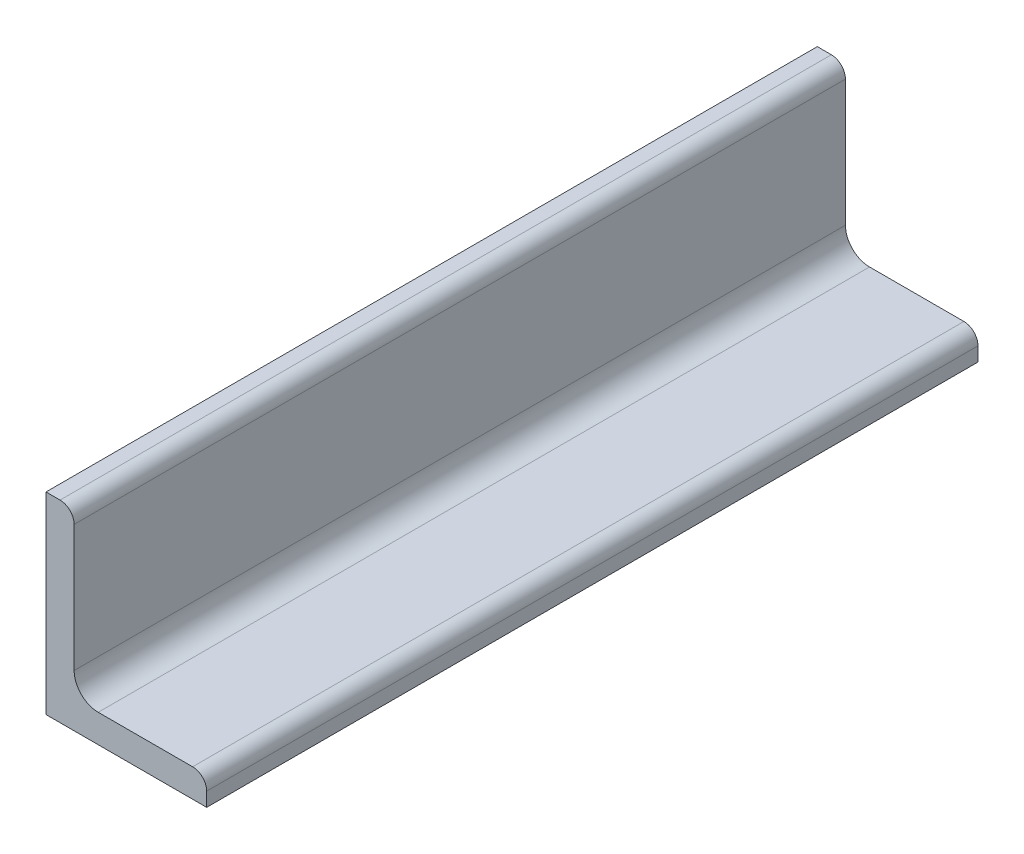
ISO-10303-21;
HEADER;
FILE_DESCRIPTION(('STEP AP214'),'2;1');
FILE_NAME('part.step','',(''),(''),'','','');
FILE_SCHEMA(('AUTOMOTIVE_DESIGN { 1 0 10303 214 1 1 1 1 }'));
ENDSEC;
DATA;
#1=APPLICATION_CONTEXT('core data for automotive mechanical design processes');
#2=APPLICATION_PROTOCOL_DEFINITION('international standard','automotive_design',2000,#1);
#3=PRODUCT_CONTEXT('',#1,'mechanical');
#4=PRODUCT('Part','Part','',(#3));
#5=PRODUCT_RELATED_PRODUCT_CATEGORY('part','',(#4));
#6=PRODUCT_DEFINITION_FORMATION('','',#4);
#7=PRODUCT_DEFINITION_CONTEXT('part definition',#1,'design');
#8=PRODUCT_DEFINITION('design','',#6,#7);
#9=PRODUCT_DEFINITION_SHAPE('','',#8);
#10=(LENGTH_UNIT() NAMED_UNIT(*) SI_UNIT(.MILLI.,.METRE.));
#11=(NAMED_UNIT(*) PLANE_ANGLE_UNIT() SI_UNIT($,.RADIAN.));
#12=(NAMED_UNIT(*) SI_UNIT($,.STERADIAN.) SOLID_ANGLE_UNIT());
#13=UNCERTAINTY_MEASURE_WITH_UNIT(LENGTH_MEASURE(1.E-05),#10,'distance_accuracy_value','');
#14=(GEOMETRIC_REPRESENTATION_CONTEXT(3) GLOBAL_UNCERTAINTY_ASSIGNED_CONTEXT((#13)) GLOBAL_UNIT_ASSIGNED_CONTEXT((#10,
#11,#12)) REPRESENTATION_CONTEXT('',''));
#15=CARTESIAN_POINT('',(0.,0.,0.));
#16=DIRECTION('',(0.,0.,1.));
#17=DIRECTION('',(1.,0.,0.));
#18=AXIS2_PLACEMENT_3D('',#15,#16,#17);
#19=CARTESIAN_POINT('',(0.897927251325018,76.2882459217981,304.8));
#20=DIRECTION('',(1.,0.,0.));
#21=DIRECTION('',(0.,0.,-1.));
#22=AXIS2_PLACEMENT_3D('',#19,#20,#21);
#23=PLANE('',#22);
#24=DIRECTION('',(0.,-1.,0.));
#25=VECTOR('',#24,1.);
#26=CARTESIAN_POINT('',(0.897927251325018,76.2882459217981,0.));
#27=LINE('',#26,#25);
#28=CARTESIAN_POINT('',(0.897927251325018,76.2882459217981,0.));
#29=VERTEX_POINT('',#28);
#30=CARTESIAN_POINT('',(0.897927251325018,0.0882459217980795,0.));
#31=VERTEX_POINT('',#30);
#32=EDGE_CURVE('E135',#29,#31,#27,.T.);
#33=ORIENTED_EDGE('',*,*,#32,.T.);
#34=DIRECTION('',(0.,0.,-1.));
#35=VECTOR('',#34,1.);
#36=CARTESIAN_POINT('',(0.897927251325018,0.0882459217980795,304.8));
#37=LINE('',#36,#35);
#38=CARTESIAN_POINT('',(0.897927251325018,0.0882459217980795,304.8));
#39=VERTEX_POINT('',#38);
#40=EDGE_CURVE('E11',#39,#31,#37,.T.);
#41=ORIENTED_EDGE('',*,*,#40,.F.);
#42=DIRECTION('',(0.,-1.,0.));
#43=VECTOR('',#42,1.);
#44=CARTESIAN_POINT('',(0.897927251325018,76.2882459217981,304.8));
#45=LINE('',#44,#43);
#46=CARTESIAN_POINT('',(0.897927251325018,76.2882459217981,304.8));
#47=VERTEX_POINT('',#46);
#48=EDGE_CURVE('E151',#47,#39,#45,.T.);
#49=ORIENTED_EDGE('',*,*,#48,.F.);
#50=DIRECTION('',(0.,0.,-1.));
#51=VECTOR('',#50,1.);
#52=CARTESIAN_POINT('',(0.897927251325018,76.2882459217981,304.8));
#53=LINE('',#52,#51);
#54=EDGE_CURVE('E131',#47,#29,#53,.T.);
#55=ORIENTED_EDGE('',*,*,#54,.T.);
#56=EDGE_LOOP('',(#33,#41,#49,#55));
#57=FACE_BOUND('',#56,.T.);
#58=ADVANCED_FACE('F33',(#57),#23,.F.);
#59=CARTESIAN_POINT('',(0.897927251325018,0.0882459217980795,304.8));
#60=DIRECTION('',(0.,1.,0.));
#61=DIRECTION('',(0.,0.,1.));
#62=AXIS2_PLACEMENT_3D('',#59,#60,#61);
#63=PLANE('',#62);
#64=DIRECTION('',(1.,0.,0.));
#65=VECTOR('',#64,1.);
#66=CARTESIAN_POINT('',(0.897927251325018,0.0882459217980795,0.));
#67=LINE('',#66,#65);
#68=CARTESIAN_POINT('',(64.397927251325,0.0882459217980795,0.));
#69=VERTEX_POINT('',#68);
#70=EDGE_CURVE('E138',#31,#69,#67,.T.);
#71=ORIENTED_EDGE('',*,*,#70,.T.);
#72=DIRECTION('',(0.,0.,-1.));
#73=VECTOR('',#72,1.);
#74=CARTESIAN_POINT('',(64.397927251325,0.0882459217980795,304.8));
#75=LINE('',#74,#73);
#76=CARTESIAN_POINT('',(64.397927251325,0.0882459217980795,304.8));
#77=VERTEX_POINT('',#76);
#78=EDGE_CURVE('E41',#77,#69,#75,.T.);
#79=ORIENTED_EDGE('',*,*,#78,.F.);
#80=DIRECTION('',(1.,0.,0.));
#81=VECTOR('',#80,1.);
#82=CARTESIAN_POINT('',(0.897927251325018,0.0882459217980795,304.8));
#83=LINE('',#82,#81);
#84=EDGE_CURVE('E95',#39,#77,#83,.T.);
#85=ORIENTED_EDGE('',*,*,#84,.F.);
#86=ORIENTED_EDGE('',*,*,#40,.T.);
#87=EDGE_LOOP('',(#71,#79,#85,#86));
#88=FACE_BOUND('',#87,.T.);
#89=ADVANCED_FACE('F194',(#88),#63,.F.);
#90=CARTESIAN_POINT('',(64.397927251325,0.0882459217980795,304.8));
#91=DIRECTION('',(-1.,0.,0.));
#92=DIRECTION('',(0.,0.,1.));
#93=AXIS2_PLACEMENT_3D('',#90,#91,#92);
#94=PLANE('',#93);
#95=DIRECTION('',(0.,1.,0.));
#96=VECTOR('',#95,1.);
#97=CARTESIAN_POINT('',(64.397927251325,0.0882459217980795,0.));
#98=LINE('',#97,#96);
#99=CARTESIAN_POINT('',(64.397927251325,5.64449592179808,0.));
#100=VERTEX_POINT('',#99);
#101=EDGE_CURVE('E140',#69,#100,#98,.T.);
#102=ORIENTED_EDGE('',*,*,#101,.T.);
#103=DIRECTION('',(0.,0.,-1.));
#104=VECTOR('',#103,1.);
#105=CARTESIAN_POINT('',(64.397927251325,5.64449592179808,304.8));
#106=LINE('',#105,#104);
#107=CARTESIAN_POINT('',(64.397927251325,5.64449592179808,304.8));
#108=VERTEX_POINT('',#107);
#109=EDGE_CURVE('E161',#108,#100,#106,.T.);
#110=ORIENTED_EDGE('',*,*,#109,.F.);
#111=DIRECTION('',(0.,1.,0.));
#112=VECTOR('',#111,1.);
#113=CARTESIAN_POINT('',(64.397927251325,0.0882459217980795,304.8));
#114=LINE('',#113,#112);
#115=EDGE_CURVE('E169',#77,#108,#114,.T.);
#116=ORIENTED_EDGE('',*,*,#115,.F.);
#117=ORIENTED_EDGE('',*,*,#78,.T.);
#118=EDGE_LOOP('',(#102,#110,#116,#117));
#119=FACE_BOUND('',#118,.T.);
#120=ADVANCED_FACE('F167',(#119),#94,.F.);
#121=CARTESIAN_POINT('',(58.841677251325,5.64449592179808,304.8));
#122=DIRECTION('',(0.,0.,-1.));
#123=DIRECTION('',(-1.,0.,0.));
#124=AXIS2_PLACEMENT_3D('',#121,#122,#123);
#125=CYLINDRICAL_SURFACE('',#124,5.55625);
#126=CARTESIAN_POINT('',(58.841677251325,5.64449592179808,0.));
#127=DIRECTION('',(0.,0.,1.));
#128=DIRECTION('',(1.,0.,0.));
#129=AXIS2_PLACEMENT_3D('',#126,#127,#128);
#130=CIRCLE('',#129,5.55625);
#131=CARTESIAN_POINT('',(58.841677251325,11.2007459217981,0.));
#132=VERTEX_POINT('',#131);
#133=EDGE_CURVE('E142',#100,#132,#130,.T.);
#134=ORIENTED_EDGE('',*,*,#133,.T.);
#135=DIRECTION('',(0.,0.,-1.));
#136=VECTOR('',#135,1.);
#137=CARTESIAN_POINT('',(58.841677251325,11.2007459217981,304.8));
#138=LINE('',#137,#136);
#139=CARTESIAN_POINT('',(58.841677251325,11.2007459217981,304.8));
#140=VERTEX_POINT('',#139);
#141=EDGE_CURVE('E158',#140,#132,#138,.T.);
#142=ORIENTED_EDGE('',*,*,#141,.F.);
#143=CARTESIAN_POINT('',(58.841677251325,5.64449592179808,304.8));
#144=DIRECTION('',(0.,0.,1.));
#145=DIRECTION('',(1.,0.,0.));
#146=AXIS2_PLACEMENT_3D('',#143,#144,#145);
#147=CIRCLE('',#146,5.55625);
#148=EDGE_CURVE('E185',#108,#140,#147,.T.);
#149=ORIENTED_EDGE('',*,*,#148,.F.);
#150=ORIENTED_EDGE('',*,*,#109,.T.);
#151=EDGE_LOOP('',(#134,#142,#149,#150));
#152=FACE_BOUND('',#151,.T.);
#153=ADVANCED_FACE('F178',(#152),#125,.T.);
#154=CARTESIAN_POINT('',(58.841677251325,11.2007459217981,304.8));
#155=DIRECTION('',(0.,-1.,0.));
#156=DIRECTION('',(0.,0.,-1.));
#157=AXIS2_PLACEMENT_3D('',#154,#155,#156);
#158=PLANE('',#157);
#159=DIRECTION('',(-1.,0.,0.));
#160=VECTOR('',#159,1.);
#161=CARTESIAN_POINT('',(58.841677251325,11.2007459217981,0.));
#162=LINE('',#161,#160);
#163=CARTESIAN_POINT('',(21.535427251325,11.2007459217981,0.));
#164=VERTEX_POINT('',#163);
#165=EDGE_CURVE('E144',#132,#164,#162,.T.);
#166=ORIENTED_EDGE('',*,*,#165,.T.);
#167=DIRECTION('',(0.,0.,-1.));
#168=VECTOR('',#167,1.);
#169=CARTESIAN_POINT('',(21.535427251325,11.2007459217981,304.8));
#170=LINE('',#169,#168);
#171=CARTESIAN_POINT('',(21.535427251325,11.2007459217981,304.8));
#172=VERTEX_POINT('',#171);
#173=EDGE_CURVE('E155',#172,#164,#170,.T.);
#174=ORIENTED_EDGE('',*,*,#173,.F.);
#175=DIRECTION('',(-1.,0.,0.));
#176=VECTOR('',#175,1.);
#177=CARTESIAN_POINT('',(58.841677251325,11.2007459217981,304.8));
#178=LINE('',#177,#176);
#179=EDGE_CURVE('E184',#140,#172,#178,.T.);
#180=ORIENTED_EDGE('',*,*,#179,.F.);
#181=ORIENTED_EDGE('',*,*,#141,.T.);
#182=EDGE_LOOP('',(#166,#174,#180,#181));
#183=FACE_BOUND('',#182,.T.);
#184=ADVANCED_FACE('F182',(#183),#158,.F.);
#185=CARTESIAN_POINT('',(21.535427251325,20.7257459217981,304.8));
#186=DIRECTION('',(0.,0.,-1.));
#187=DIRECTION('',(-1.,0.,0.));
#188=AXIS2_PLACEMENT_3D('',#185,#186,#187);
#189=CYLINDRICAL_SURFACE('',#188,9.52499999999999);
#190=CARTESIAN_POINT('',(21.535427251325,20.7257459217981,0.));
#191=DIRECTION('',(0.,0.,-1.));
#192=DIRECTION('',(1.,0.,0.));
#193=AXIS2_PLACEMENT_3D('',#190,#191,#192);
#194=CIRCLE('',#193,9.52499999999999);
#195=CARTESIAN_POINT('',(12.010427251325,20.7257459217981,0.));
#196=VERTEX_POINT('',#195);
#197=EDGE_CURVE('E146',#164,#196,#194,.T.);
#198=ORIENTED_EDGE('',*,*,#197,.T.);
#199=DIRECTION('',(0.,0.,-1.));
#200=VECTOR('',#199,1.);
#201=CARTESIAN_POINT('',(12.010427251325,20.7257459217981,304.8));
#202=LINE('',#201,#200);
#203=CARTESIAN_POINT('',(12.010427251325,20.7257459217981,304.8));
#204=VERTEX_POINT('',#203);
#205=EDGE_CURVE('E126',#204,#196,#202,.T.);
#206=ORIENTED_EDGE('',*,*,#205,.F.);
#207=CARTESIAN_POINT('',(21.535427251325,20.7257459217981,304.8));
#208=DIRECTION('',(0.,0.,-1.));
#209=DIRECTION('',(1.,0.,0.));
#210=AXIS2_PLACEMENT_3D('',#207,#208,#209);
#211=CIRCLE('',#210,9.52499999999999);
#212=EDGE_CURVE('E117',#172,#204,#211,.T.);
#213=ORIENTED_EDGE('',*,*,#212,.F.);
#214=ORIENTED_EDGE('',*,*,#173,.T.);
#215=EDGE_LOOP('',(#198,#206,#213,#214));
#216=FACE_BOUND('',#215,.T.);
#217=ADVANCED_FACE('F206',(#216),#189,.F.);
#218=CARTESIAN_POINT('',(12.010427251325,20.7257459217981,304.8));
#219=DIRECTION('',(-1.,0.,0.));
#220=DIRECTION('',(0.,0.,1.));
#221=AXIS2_PLACEMENT_3D('',#218,#219,#220);
#222=PLANE('',#221);
#223=DIRECTION('',(0.,1.,0.));
#224=VECTOR('',#223,1.);
#225=CARTESIAN_POINT('',(12.010427251325,20.7257459217981,0.));
#226=LINE('',#225,#224);
#227=CARTESIAN_POINT('',(12.010427251325,70.7319959217981,0.));
#228=VERTEX_POINT('',#227);
#229=EDGE_CURVE('E125',#196,#228,#226,.T.);
#230=ORIENTED_EDGE('',*,*,#229,.T.);
#231=DIRECTION('',(0.,0.,-1.));
#232=VECTOR('',#231,1.);
#233=CARTESIAN_POINT('',(12.010427251325,70.7319959217981,304.8));
#234=LINE('',#233,#232);
#235=CARTESIAN_POINT('',(12.010427251325,70.7319959217981,304.8));
#236=VERTEX_POINT('',#235);
#237=EDGE_CURVE('E122',#236,#228,#234,.T.);
#238=ORIENTED_EDGE('',*,*,#237,.F.);
#239=DIRECTION('',(0.,1.,0.));
#240=VECTOR('',#239,1.);
#241=CARTESIAN_POINT('',(12.010427251325,20.7257459217981,304.8));
#242=LINE('',#241,#240);
#243=EDGE_CURVE('E111',#204,#236,#242,.T.);
#244=ORIENTED_EDGE('',*,*,#243,.F.);
#245=ORIENTED_EDGE('',*,*,#205,.T.);
#246=EDGE_LOOP('',(#230,#238,#244,#245));
#247=FACE_BOUND('',#246,.T.);
#248=ADVANCED_FACE('F123',(#247),#222,.F.);
#249=CARTESIAN_POINT('',(6.45417725132501,70.7319959217981,304.8));
#250=DIRECTION('',(0.,0.,-1.));
#251=DIRECTION('',(-1.,0.,0.));
#252=AXIS2_PLACEMENT_3D('',#249,#250,#251);
#253=CYLINDRICAL_SURFACE('',#252,5.55625);
#254=CARTESIAN_POINT('',(6.45417725132501,70.7319959217981,0.));
#255=DIRECTION('',(0.,0.,1.));
#256=DIRECTION('',(1.,0.,0.));
#257=AXIS2_PLACEMENT_3D('',#254,#255,#256);
#258=CIRCLE('',#257,5.55625);
#259=CARTESIAN_POINT('',(6.45417725132502,76.2882459217981,0.));
#260=VERTEX_POINT('',#259);
#261=EDGE_CURVE('E81',#228,#260,#258,.T.);
#262=ORIENTED_EDGE('',*,*,#261,.T.);
#263=DIRECTION('',(0.,0.,-1.));
#264=VECTOR('',#263,1.);
#265=CARTESIAN_POINT('',(6.45417725132502,76.2882459217981,304.8));
#266=LINE('',#265,#264);
#267=CARTESIAN_POINT('',(6.45417725132502,76.2882459217981,304.8));
#268=VERTEX_POINT('',#267);
#269=EDGE_CURVE('E127',#268,#260,#266,.T.);
#270=ORIENTED_EDGE('',*,*,#269,.F.);
#271=CARTESIAN_POINT('',(6.45417725132501,70.7319959217981,304.8));
#272=DIRECTION('',(0.,0.,1.));
#273=DIRECTION('',(1.,0.,0.));
#274=AXIS2_PLACEMENT_3D('',#271,#272,#273);
#275=CIRCLE('',#274,5.55625);
#276=EDGE_CURVE('E115',#236,#268,#275,.T.);
#277=ORIENTED_EDGE('',*,*,#276,.F.);
#278=ORIENTED_EDGE('',*,*,#237,.T.);
#279=EDGE_LOOP('',(#262,#270,#277,#278));
#280=FACE_BOUND('',#279,.T.);
#281=ADVANCED_FACE('F129',(#280),#253,.T.);
#282=CARTESIAN_POINT('',(6.45417725132502,76.2882459217981,304.8));
#283=DIRECTION('',(0.,-1.,0.));
#284=DIRECTION('',(0.,0.,-1.));
#285=AXIS2_PLACEMENT_3D('',#282,#283,#284);
#286=PLANE('',#285);
#287=DIRECTION('',(-1.,0.,0.));
#288=VECTOR('',#287,1.);
#289=CARTESIAN_POINT('',(6.45417725132502,76.2882459217981,0.));
#290=LINE('',#289,#288);
#291=EDGE_CURVE('E87',#260,#29,#290,.T.);
#292=ORIENTED_EDGE('',*,*,#291,.T.);
#293=ORIENTED_EDGE('',*,*,#54,.F.);
#294=DIRECTION('',(-1.,0.,0.));
#295=VECTOR('',#294,1.);
#296=CARTESIAN_POINT('',(6.45417725132502,76.2882459217981,304.8));
#297=LINE('',#296,#295);
#298=EDGE_CURVE('E49',#268,#47,#297,.T.);
#299=ORIENTED_EDGE('',*,*,#298,.F.);
#300=ORIENTED_EDGE('',*,*,#269,.T.);
#301=EDGE_LOOP('',(#292,#293,#299,#300));
#302=FACE_BOUND('',#301,.T.);
#303=ADVANCED_FACE('F214',(#302),#286,.F.);
#304=CARTESIAN_POINT('',(58.841677251325,5.64449592179808,304.8));
#305=DIRECTION('',(0.,0.,1.));
#306=DIRECTION('',(1.,0.,0.));
#307=AXIS2_PLACEMENT_3D('',#304,#305,#306);
#308=PLANE('',#307);
#309=ORIENTED_EDGE('',*,*,#48,.T.);
#310=ORIENTED_EDGE('',*,*,#84,.T.);
#311=ORIENTED_EDGE('',*,*,#115,.T.);
#312=ORIENTED_EDGE('',*,*,#148,.T.);
#313=ORIENTED_EDGE('',*,*,#179,.T.);
#314=ORIENTED_EDGE('',*,*,#212,.T.);
#315=ORIENTED_EDGE('',*,*,#243,.T.);
#316=ORIENTED_EDGE('',*,*,#276,.T.);
#317=ORIENTED_EDGE('',*,*,#298,.T.);
#318=EDGE_LOOP('',(#309,#310,#311,#312,#313,#314,#315,#316,#317));
#319=FACE_BOUND('',#318,.T.);
#320=ADVANCED_FACE('F113',(#319),#308,.T.);
#321=CARTESIAN_POINT('',(58.841677251325,5.64449592179808,0.));
#322=DIRECTION('',(0.,0.,1.));
#323=DIRECTION('',(1.,0.,0.));
#324=AXIS2_PLACEMENT_3D('',#321,#322,#323);
#325=PLANE('',#324);
#326=ORIENTED_EDGE('',*,*,#32,.F.);
#327=ORIENTED_EDGE('',*,*,#291,.F.);
#328=ORIENTED_EDGE('',*,*,#261,.F.);
#329=ORIENTED_EDGE('',*,*,#229,.F.);
#330=ORIENTED_EDGE('',*,*,#197,.F.);
#331=ORIENTED_EDGE('',*,*,#165,.F.);
#332=ORIENTED_EDGE('',*,*,#133,.F.);
#333=ORIENTED_EDGE('',*,*,#101,.F.);
#334=ORIENTED_EDGE('',*,*,#70,.F.);
#335=EDGE_LOOP('',(#326,#327,#328,#329,#330,#331,#332,#333,#334));
#336=FACE_BOUND('',#335,.T.);
#337=ADVANCED_FACE('F173',(#336),#325,.F.);
#338=CLOSED_SHELL('',(#58,#89,#120,#153,#184,#217,#248,#281,#303,#320,#337));
#339=MANIFOLD_SOLID_BREP('B2',#338);
#340=ADVANCED_BREP_SHAPE_REPRESENTATION('',(#18,#339),#14);
#341=SHAPE_DEFINITION_REPRESENTATION(#9,#340);
ENDSEC;
END-ISO-10303-21;
